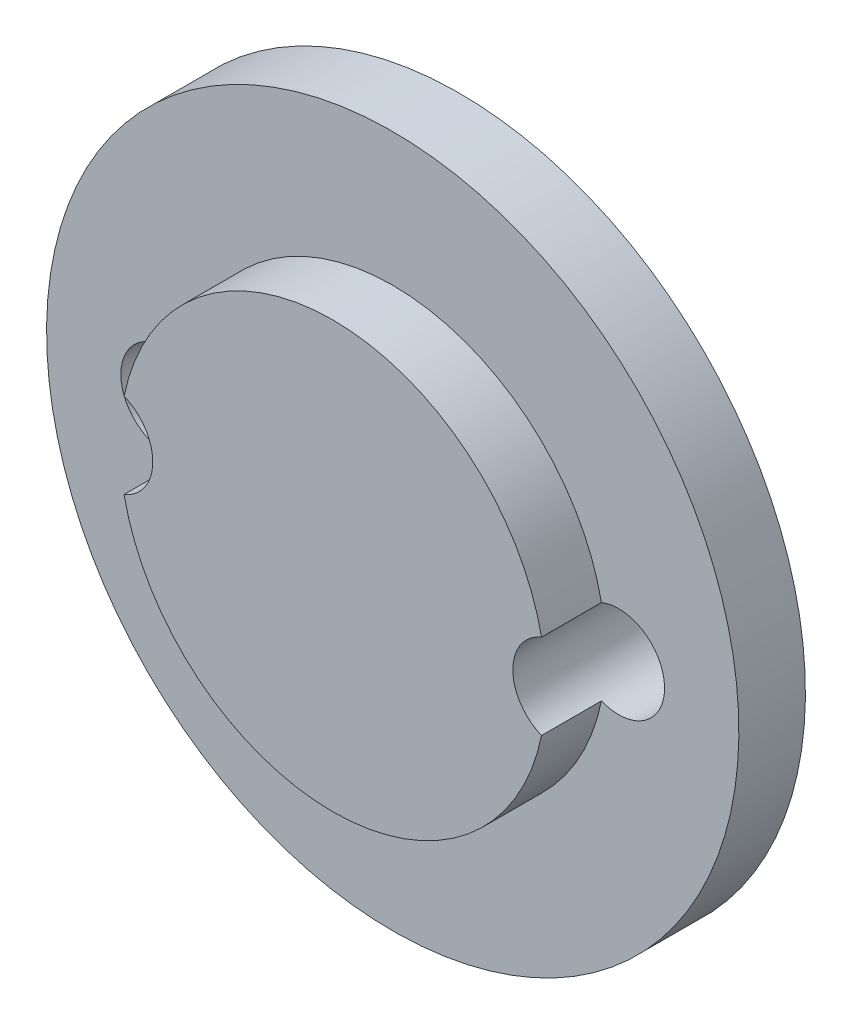
ISO-10303-21;
HEADER;
FILE_DESCRIPTION(('STEP AP214'),'2;1');
FILE_NAME('part.step','',(''),(''),'','','');
FILE_SCHEMA(('AUTOMOTIVE_DESIGN { 1 0 10303 214 1 1 1 1 }'));
ENDSEC;
DATA;
#1=APPLICATION_CONTEXT('core data for automotive mechanical design processes');
#2=APPLICATION_PROTOCOL_DEFINITION('international standard','automotive_design',2000,#1);
#3=PRODUCT_CONTEXT('',#1,'mechanical');
#4=PRODUCT('Part','Part','',(#3));
#5=PRODUCT_RELATED_PRODUCT_CATEGORY('part','',(#4));
#6=PRODUCT_DEFINITION_FORMATION('','',#4);
#7=PRODUCT_DEFINITION_CONTEXT('part definition',#1,'design');
#8=PRODUCT_DEFINITION('design','',#6,#7);
#9=PRODUCT_DEFINITION_SHAPE('','',#8);
#10=(LENGTH_UNIT() NAMED_UNIT(*) SI_UNIT(.MILLI.,.METRE.));
#11=(NAMED_UNIT(*) PLANE_ANGLE_UNIT() SI_UNIT($,.RADIAN.));
#12=(NAMED_UNIT(*) SI_UNIT($,.STERADIAN.) SOLID_ANGLE_UNIT());
#13=UNCERTAINTY_MEASURE_WITH_UNIT(LENGTH_MEASURE(1.E-05),#10,'distance_accuracy_value','');
#14=(GEOMETRIC_REPRESENTATION_CONTEXT(3) GLOBAL_UNCERTAINTY_ASSIGNED_CONTEXT((#13)) GLOBAL_UNIT_ASSIGNED_CONTEXT((#10,
#11,#12)) REPRESENTATION_CONTEXT('',''));
#15=CARTESIAN_POINT('',(0.,0.,0.));
#16=DIRECTION('',(0.,0.,1.));
#17=DIRECTION('',(1.,0.,0.));
#18=AXIS2_PLACEMENT_3D('',#15,#16,#17);
#19=CARTESIAN_POINT('',(-36.475088035676,41.2248544872212,245.350002717972));
#20=DIRECTION('',(0.,0.,1.));
#21=DIRECTION('',(-0.707106781186548,-0.707106781186547,0.));
#22=AXIS2_PLACEMENT_3D('',#19,#20,#21);
#23=PLANE('',#22);
#24=CARTESIAN_POINT('',(-36.475088035676,41.2248544872212,245.350002717972));
#25=DIRECTION('',(0.,0.,1.));
#26=DIRECTION('',(0.707106781186548,0.707106781186547,0.));
#27=AXIS2_PLACEMENT_3D('',#24,#25,#26);
#28=CIRCLE('',#27,8.);
#29=CARTESIAN_POINT('',(-28.6365515668759,42.8240249056849,245.350002717972));
#30=VERTEX_POINT('',#29);
#31=CARTESIAN_POINT('',(-44.3136245044762,42.8240249056849,245.350002717972));
#32=VERTEX_POINT('',#31);
#33=EDGE_CURVE('E10',#30,#32,#28,.T.);
#34=ORIENTED_EDGE('',*,*,#33,.T.);
#35=CARTESIAN_POINT('',(-44.9603694099146,41.2248544872212,245.350002717972));
#36=DIRECTION('',(0.,0.,-1.));
#37=DIRECTION('',(0.707106781186548,0.707106781186547,0.));
#38=AXIS2_PLACEMENT_3D('',#35,#36,#37);
#39=CIRCLE('',#38,1.725);
#40=CARTESIAN_POINT('',(-44.3136245044762,39.6256840687575,245.350002717972));
#41=VERTEX_POINT('',#40);
#42=EDGE_CURVE('E25',#32,#41,#39,.T.);
#43=ORIENTED_EDGE('',*,*,#42,.T.);
#44=CARTESIAN_POINT('',(-36.475088035676,41.2248544872212,245.350002717972));
#45=DIRECTION('',(0.,0.,1.));
#46=DIRECTION('',(0.707106781186548,0.707106781186547,0.));
#47=AXIS2_PLACEMENT_3D('',#44,#45,#46);
#48=CIRCLE('',#47,8.);
#49=CARTESIAN_POINT('',(-28.6365515668758,39.6256840687575,245.350002717972));
#50=VERTEX_POINT('',#49);
#51=EDGE_CURVE('E104',#41,#50,#48,.T.);
#52=ORIENTED_EDGE('',*,*,#51,.T.);
#53=CARTESIAN_POINT('',(-27.9898066614374,41.2248544872212,245.350002717972));
#54=DIRECTION('',(0.,0.,-1.));
#55=DIRECTION('',(0.707106781186548,0.707106781186547,0.));
#56=AXIS2_PLACEMENT_3D('',#53,#54,#55);
#57=CIRCLE('',#56,1.725);
#58=EDGE_CURVE('E100',#50,#30,#57,.T.);
#59=ORIENTED_EDGE('',*,*,#58,.T.);
#60=EDGE_LOOP('',(#34,#43,#52,#59));
#61=FACE_BOUND('',#60,.T.);
#62=ADVANCED_FACE('F15',(#61),#23,.T.);
#63=CARTESIAN_POINT('',(-36.475088035676,41.2248544872212,243.100002717972));
#64=DIRECTION('',(0.,0.,1.));
#65=DIRECTION('',(0.707106781186548,0.707106781186547,0.));
#66=AXIS2_PLACEMENT_3D('',#63,#64,#65);
#67=PLANE('',#66);
#68=CARTESIAN_POINT('',(-36.475088035676,41.2248544872212,243.100002717972));
#69=DIRECTION('',(0.,0.,1.));
#70=DIRECTION('',(0.707106781186548,0.707106781186547,0.));
#71=AXIS2_PLACEMENT_3D('',#68,#69,#70);
#72=CIRCLE('',#71,13.);
#73=CARTESIAN_POINT('',(-27.2826998802509,50.4172426426463,243.100002717972));
#74=VERTEX_POINT('',#73);
#75=EDGE_CURVE('E98',#74,#74,#72,.T.);
#76=ORIENTED_EDGE('',*,*,#75,.T.);
#77=EDGE_LOOP('',(#76));
#78=FACE_BOUND('',#77,.T.);
#79=CARTESIAN_POINT('',(-36.475088035676,41.2248544872212,243.100002717972));
#80=DIRECTION('',(0.,0.,-1.));
#81=DIRECTION('',(0.707106781186548,0.707106781186547,0.));
#82=AXIS2_PLACEMENT_3D('',#79,#80,#81);
#83=CIRCLE('',#82,8.);
#84=CARTESIAN_POINT('',(-28.6365515668758,39.6256840687575,243.100002717972));
#85=VERTEX_POINT('',#84);
#86=CARTESIAN_POINT('',(-44.3136245044762,39.6256840687575,243.100002717972));
#87=VERTEX_POINT('',#86);
#88=EDGE_CURVE('E101',#85,#87,#83,.T.);
#89=ORIENTED_EDGE('',*,*,#88,.T.);
#90=CARTESIAN_POINT('',(-44.9603694099146,41.2248544872212,243.100002717972));
#91=DIRECTION('',(0.,0.,-1.));
#92=DIRECTION('',(0.707106781186548,0.707106781186547,0.));
#93=AXIS2_PLACEMENT_3D('',#90,#91,#92);
#94=CIRCLE('',#93,1.725);
#95=CARTESIAN_POINT('',(-44.3136245044762,42.8240249056849,243.100002717972));
#96=VERTEX_POINT('',#95);
#97=EDGE_CURVE('E70',#87,#96,#94,.T.);
#98=ORIENTED_EDGE('',*,*,#97,.T.);
#99=CARTESIAN_POINT('',(-36.475088035676,41.2248544872212,243.100002717972));
#100=DIRECTION('',(0.,0.,-1.));
#101=DIRECTION('',(0.707106781186548,0.707106781186547,0.));
#102=AXIS2_PLACEMENT_3D('',#99,#100,#101);
#103=CIRCLE('',#102,8.);
#104=CARTESIAN_POINT('',(-28.6365515668759,42.8240249056849,243.100002717972));
#105=VERTEX_POINT('',#104);
#106=EDGE_CURVE('E53',#96,#105,#103,.T.);
#107=ORIENTED_EDGE('',*,*,#106,.T.);
#108=CARTESIAN_POINT('',(-27.9898066614374,41.2248544872212,243.100002717972));
#109=DIRECTION('',(0.,0.,-1.));
#110=DIRECTION('',(0.707106781186548,0.707106781186547,0.));
#111=AXIS2_PLACEMENT_3D('',#108,#109,#110);
#112=CIRCLE('',#111,1.725);
#113=EDGE_CURVE('E59',#105,#85,#112,.T.);
#114=ORIENTED_EDGE('',*,*,#113,.T.);
#115=EDGE_LOOP('',(#89,#98,#107,#114));
#116=FACE_BOUND('',#115,.T.);
#117=ADVANCED_FACE('F69',(#78,#116),#67,.T.);
#118=CARTESIAN_POINT('',(-27.9898066614374,41.2248544872212,243.100001168251));
#119=DIRECTION('',(0.,0.,1.));
#120=DIRECTION('',(0.707106781186548,0.707106781186547,0.));
#121=AXIS2_PLACEMENT_3D('',#118,#119,#120);
#122=CYLINDRICAL_SURFACE('',#121,1.725);
#123=ORIENTED_EDGE('',*,*,#113,.F.);
#124=DIRECTION('',(0.,0.,-1.));
#125=VECTOR('',#124,1.);
#126=CARTESIAN_POINT('',(-28.6365515668759,42.8240249056849,243.100001168251));
#127=LINE('',#126,#125);
#128=EDGE_CURVE('E62',#30,#105,#127,.T.);
#129=ORIENTED_EDGE('',*,*,#128,.F.);
#130=ORIENTED_EDGE('',*,*,#58,.F.);
#131=DIRECTION('',(0.,0.,1.));
#132=VECTOR('',#131,1.);
#133=CARTESIAN_POINT('',(-28.6365515668758,39.6256840687575,243.100001168251));
#134=LINE('',#133,#132);
#135=EDGE_CURVE('E64',#85,#50,#134,.T.);
#136=ORIENTED_EDGE('',*,*,#135,.F.);
#137=EDGE_LOOP('',(#123,#129,#130,#136));
#138=FACE_BOUND('',#137,.T.);
#139=CARTESIAN_POINT('',(-27.9898066614374,41.2248544872212,240.600002717972));
#140=DIRECTION('',(0.,0.,1.));
#141=DIRECTION('',(0.707106781186548,0.707106781186547,0.));
#142=AXIS2_PLACEMENT_3D('',#139,#140,#141);
#143=CIRCLE('',#142,1.725);
#144=CARTESIAN_POINT('',(-26.7700474638906,42.444613684768,240.600002717972));
#145=VERTEX_POINT('',#144);
#146=EDGE_CURVE('E80',#145,#145,#143,.T.);
#147=ORIENTED_EDGE('',*,*,#146,.F.);
#148=EDGE_LOOP('',(#147));
#149=FACE_BOUND('',#148,.T.);
#150=ADVANCED_FACE('F60',(#138,#149),#122,.F.);
#151=CARTESIAN_POINT('',(-36.475088035676,41.2248544872212,245.600002717972));
#152=DIRECTION('',(0.,0.,-1.));
#153=DIRECTION('',(0.707106781186548,0.707106781186547,0.));
#154=AXIS2_PLACEMENT_3D('',#151,#152,#153);
#155=CYLINDRICAL_SURFACE('',#154,8.);
#156=ORIENTED_EDGE('',*,*,#128,.T.);
#157=ORIENTED_EDGE('',*,*,#106,.F.);
#158=DIRECTION('',(0.,0.,1.));
#159=VECTOR('',#158,1.);
#160=CARTESIAN_POINT('',(-44.3136245044762,42.8240249056849,243.100001168251));
#161=LINE('',#160,#159);
#162=EDGE_CURVE('E74',#96,#32,#161,.T.);
#163=ORIENTED_EDGE('',*,*,#162,.T.);
#164=ORIENTED_EDGE('',*,*,#33,.F.);
#165=EDGE_LOOP('',(#156,#157,#163,#164));
#166=FACE_BOUND('',#165,.T.);
#167=ADVANCED_FACE('F73',(#166),#155,.T.);
#168=CARTESIAN_POINT('',(-44.9603694099146,41.2248544872212,243.100001168251));
#169=DIRECTION('',(0.,0.,1.));
#170=DIRECTION('',(0.707106781186548,0.707106781186547,0.));
#171=AXIS2_PLACEMENT_3D('',#168,#169,#170);
#172=CYLINDRICAL_SURFACE('',#171,1.725);
#173=ORIENTED_EDGE('',*,*,#42,.F.);
#174=ORIENTED_EDGE('',*,*,#162,.F.);
#175=ORIENTED_EDGE('',*,*,#97,.F.);
#176=DIRECTION('',(0.,0.,-1.));
#177=VECTOR('',#176,1.);
#178=CARTESIAN_POINT('',(-44.3136245044762,39.6256840687575,243.100001168251));
#179=LINE('',#178,#177);
#180=EDGE_CURVE('E76',#41,#87,#179,.T.);
#181=ORIENTED_EDGE('',*,*,#180,.F.);
#182=EDGE_LOOP('',(#173,#174,#175,#181));
#183=FACE_BOUND('',#182,.T.);
#184=CARTESIAN_POINT('',(-44.9603694099146,41.2248544872212,240.600002717972));
#185=DIRECTION('',(0.,0.,1.));
#186=DIRECTION('',(0.707106781186548,0.707106781186547,0.));
#187=AXIS2_PLACEMENT_3D('',#184,#185,#186);
#188=CIRCLE('',#187,1.725);
#189=CARTESIAN_POINT('',(-43.7406102123678,42.444613684768,240.600002717972));
#190=VERTEX_POINT('',#189);
#191=EDGE_CURVE('E82',#190,#190,#188,.T.);
#192=ORIENTED_EDGE('',*,*,#191,.F.);
#193=EDGE_LOOP('',(#192));
#194=FACE_BOUND('',#193,.T.);
#195=ADVANCED_FACE('F112',(#183,#194),#172,.F.);
#196=CARTESIAN_POINT('',(-36.475088035676,41.2248544872212,245.600002717972));
#197=DIRECTION('',(0.,0.,-1.));
#198=DIRECTION('',(0.707106781186548,0.707106781186547,0.));
#199=AXIS2_PLACEMENT_3D('',#196,#197,#198);
#200=CYLINDRICAL_SURFACE('',#199,8.);
#201=ORIENTED_EDGE('',*,*,#180,.T.);
#202=ORIENTED_EDGE('',*,*,#88,.F.);
#203=ORIENTED_EDGE('',*,*,#135,.T.);
#204=ORIENTED_EDGE('',*,*,#51,.F.);
#205=EDGE_LOOP('',(#201,#202,#203,#204));
#206=FACE_BOUND('',#205,.T.);
#207=ADVANCED_FACE('F95',(#206),#200,.T.);
#208=CARTESIAN_POINT('',(-36.475088035676,41.2248544872212,243.100002717972));
#209=DIRECTION('',(0.,0.,1.));
#210=DIRECTION('',(0.707106781186548,0.707106781186547,0.));
#211=AXIS2_PLACEMENT_3D('',#208,#209,#210);
#212=CYLINDRICAL_SURFACE('',#211,13.);
#213=CARTESIAN_POINT('',(-36.475088035676,41.2248544872212,240.600002717972));
#214=DIRECTION('',(0.,0.,-1.));
#215=DIRECTION('',(0.707106781186548,0.707106781186547,0.));
#216=AXIS2_PLACEMENT_3D('',#213,#214,#215);
#217=CIRCLE('',#216,13.);
#218=CARTESIAN_POINT('',(-27.2826998802509,50.4172426426463,240.600002717972));
#219=VERTEX_POINT('',#218);
#220=EDGE_CURVE('E19',#219,#219,#217,.T.);
#221=ORIENTED_EDGE('',*,*,#220,.F.);
#222=EDGE_LOOP('',(#221));
#223=FACE_BOUND('',#222,.T.);
#224=ORIENTED_EDGE('',*,*,#75,.F.);
#225=EDGE_LOOP('',(#224));
#226=FACE_BOUND('',#225,.T.);
#227=ADVANCED_FACE('F92',(#223,#226),#212,.T.);
#228=CARTESIAN_POINT('',(-36.475088035676,41.2248544872212,240.600002717972));
#229=DIRECTION('',(0.,0.,-1.));
#230=DIRECTION('',(-0.707106781186548,-0.707106781186547,0.));
#231=AXIS2_PLACEMENT_3D('',#228,#229,#230);
#232=PLANE('',#231);
#233=ORIENTED_EDGE('',*,*,#146,.T.);
#234=EDGE_LOOP('',(#233));
#235=FACE_BOUND('',#234,.T.);
#236=ORIENTED_EDGE('',*,*,#191,.T.);
#237=EDGE_LOOP('',(#236));
#238=FACE_BOUND('',#237,.T.);
#239=ORIENTED_EDGE('',*,*,#220,.T.);
#240=EDGE_LOOP('',(#239));
#241=FACE_BOUND('',#240,.T.);
#242=ADVANCED_FACE('F17',(#235,#238,#241),#232,.T.);
#243=CLOSED_SHELL('',(#62,#117,#150,#167,#195,#207,#227,#242));
#244=MANIFOLD_SOLID_BREP('B1',#243);
#245=ADVANCED_BREP_SHAPE_REPRESENTATION('',(#18,#244),#14);
#246=SHAPE_DEFINITION_REPRESENTATION(#9,#245);
ENDSEC;
END-ISO-10303-21;
